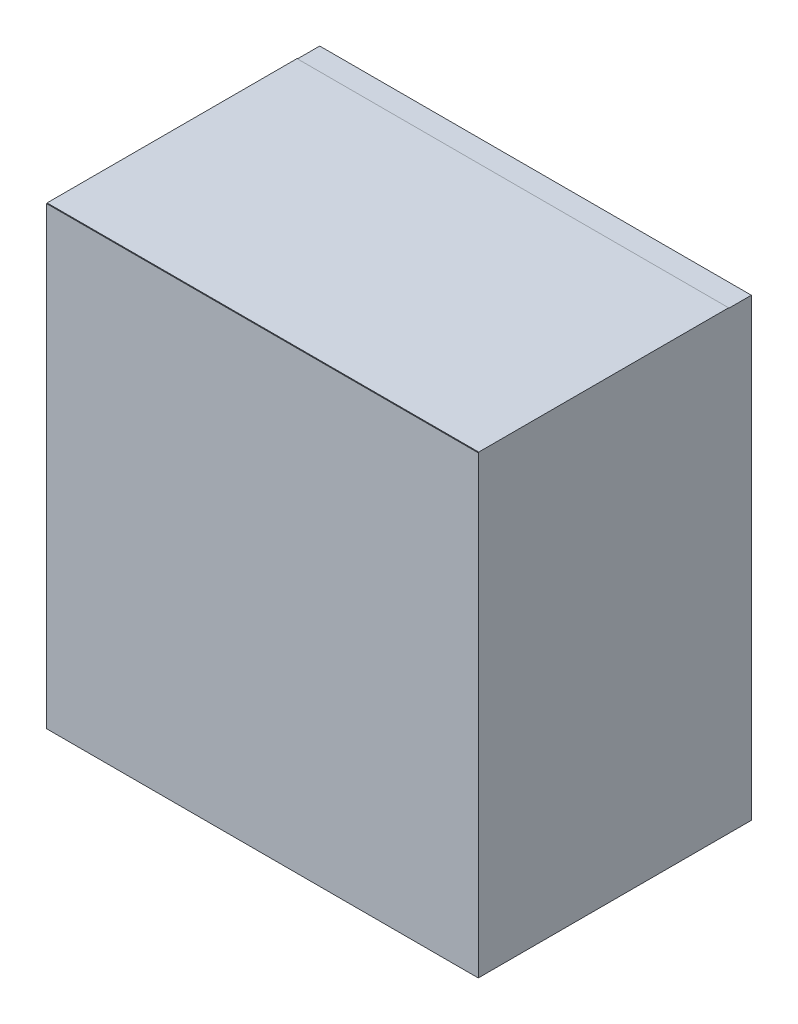
ISO-10303-21;
HEADER;
FILE_DESCRIPTION(('STEP AP214'),'2;1');
FILE_NAME('part.step','',(''),(''),'','','');
FILE_SCHEMA(('AUTOMOTIVE_DESIGN { 1 0 10303 214 1 1 1 1 }'));
ENDSEC;
DATA;
#1=APPLICATION_CONTEXT('core data for automotive mechanical design processes');
#2=APPLICATION_PROTOCOL_DEFINITION('international standard','automotive_design',2000,#1);
#3=PRODUCT_CONTEXT('',#1,'mechanical');
#4=PRODUCT('Part','Part','',(#3));
#5=PRODUCT_RELATED_PRODUCT_CATEGORY('part','',(#4));
#6=PRODUCT_DEFINITION_FORMATION('','',#4);
#7=PRODUCT_DEFINITION_CONTEXT('part definition',#1,'design');
#8=PRODUCT_DEFINITION('design','',#6,#7);
#9=PRODUCT_DEFINITION_SHAPE('','',#8);
#10=(LENGTH_UNIT() NAMED_UNIT(*) SI_UNIT(.MILLI.,.METRE.));
#11=(NAMED_UNIT(*) PLANE_ANGLE_UNIT() SI_UNIT($,.RADIAN.));
#12=(NAMED_UNIT(*) SI_UNIT($,.STERADIAN.) SOLID_ANGLE_UNIT());
#13=UNCERTAINTY_MEASURE_WITH_UNIT(LENGTH_MEASURE(1.E-05),#10,'distance_accuracy_value','');
#14=(GEOMETRIC_REPRESENTATION_CONTEXT(3) GLOBAL_UNCERTAINTY_ASSIGNED_CONTEXT((#13)) GLOBAL_UNIT_ASSIGNED_CONTEXT((#10,
#11,#12)) REPRESENTATION_CONTEXT('',''));
#15=CARTESIAN_POINT('',(0.,0.,0.));
#16=DIRECTION('',(0.,0.,1.));
#17=DIRECTION('',(1.,0.,0.));
#18=AXIS2_PLACEMENT_3D('',#15,#16,#17);
#19=CARTESIAN_POINT('',(-950.,1002.,1.16341445918999E-13));
#20=DIRECTION('',(0.,0.,-1.));
#21=DIRECTION('',(-1.,0.,0.));
#22=AXIS2_PLACEMENT_3D('',#19,#20,#21);
#23=PLANE('',#22);
#24=DIRECTION('',(-1.,0.,0.));
#25=VECTOR('',#24,1.);
#26=CARTESIAN_POINT('',(-950.,1001.,0.));
#27=LINE('',#26,#25);
#28=CARTESIAN_POINT('',(0.,1001.,0.));
#29=VERTEX_POINT('',#28);
#30=CARTESIAN_POINT('',(-950.,1001.,0.));
#31=VERTEX_POINT('',#30);
#32=EDGE_CURVE('E132',#29,#31,#27,.T.);
#33=ORIENTED_EDGE('',*,*,#32,.F.);
#34=DIRECTION('',(0.,-1.,0.));
#35=VECTOR('',#34,1.);
#36=CARTESIAN_POINT('',(0.,1002.,0.));
#37=LINE('',#36,#35);
#38=CARTESIAN_POINT('',(0.,1002.,0.));
#39=VERTEX_POINT('',#38);
#40=EDGE_CURVE('E56',#39,#29,#37,.T.);
#41=ORIENTED_EDGE('',*,*,#40,.F.);
#42=DIRECTION('',(1.,0.,0.));
#43=VECTOR('',#42,1.);
#44=CARTESIAN_POINT('',(-950.,1002.,1.16341445918999E-13));
#45=LINE('',#44,#43);
#46=CARTESIAN_POINT('',(-950.,1002.,1.16341445918999E-13));
#47=VERTEX_POINT('',#46);
#48=EDGE_CURVE('E160',#47,#39,#45,.T.);
#49=ORIENTED_EDGE('',*,*,#48,.F.);
#50=DIRECTION('',(0.,-1.,0.));
#51=VECTOR('',#50,1.);
#52=CARTESIAN_POINT('',(-950.,1002.,1.16341445918999E-13));
#53=LINE('',#52,#51);
#54=EDGE_CURVE('E11',#47,#31,#53,.T.);
#55=ORIENTED_EDGE('',*,*,#54,.T.);
#56=EDGE_LOOP('',(#33,#41,#49,#55));
#57=FACE_BOUND('',#56,.T.);
#58=ADVANCED_FACE('F47',(#57),#23,.F.);
#59=CARTESIAN_POINT('',(-950.,1002.,-550.));
#60=DIRECTION('',(1.,0.,0.));
#61=DIRECTION('',(0.,0.,-1.));
#62=AXIS2_PLACEMENT_3D('',#59,#60,#61);
#63=PLANE('',#62);
#64=DIRECTION('',(0.,0.,1.));
#65=VECTOR('',#64,1.);
#66=CARTESIAN_POINT('',(-950.,0.,-600.));
#67=LINE('',#66,#65);
#68=CARTESIAN_POINT('',(-950.,0.,-600.));
#69=VERTEX_POINT('',#68);
#70=CARTESIAN_POINT('',(-950.,0.,1.));
#71=VERTEX_POINT('',#70);
#72=EDGE_CURVE('E108',#69,#71,#67,.T.);
#73=ORIENTED_EDGE('',*,*,#72,.T.);
#74=DIRECTION('',(0.,-1.,0.));
#75=VECTOR('',#74,1.);
#76=CARTESIAN_POINT('',(-950.,1001.,1.));
#77=LINE('',#76,#75);
#78=CARTESIAN_POINT('',(-950.,1001.,1.));
#79=VERTEX_POINT('',#78);
#80=EDGE_CURVE('E112',#79,#71,#77,.T.);
#81=ORIENTED_EDGE('',*,*,#80,.F.);
#82=DIRECTION('',(0.,0.,-1.));
#83=VECTOR('',#82,1.);
#84=CARTESIAN_POINT('',(-950.,1001.,1.));
#85=LINE('',#84,#83);
#86=EDGE_CURVE('E137',#79,#31,#85,.T.);
#87=ORIENTED_EDGE('',*,*,#86,.T.);
#88=ORIENTED_EDGE('',*,*,#54,.F.);
#89=DIRECTION('',(0.,0.,1.));
#90=VECTOR('',#89,1.);
#91=CARTESIAN_POINT('',(-950.,1002.,-550.));
#92=LINE('',#91,#90);
#93=CARTESIAN_POINT('',(-950.,1002.,-550.));
#94=VERTEX_POINT('',#93);
#95=EDGE_CURVE('E158',#94,#47,#92,.T.);
#96=ORIENTED_EDGE('',*,*,#95,.F.);
#97=DIRECTION('',(0.,-1.,0.));
#98=VECTOR('',#97,1.);
#99=CARTESIAN_POINT('',(-950.,1002.,-550.));
#100=LINE('',#99,#98);
#101=CARTESIAN_POINT('',(-950.,1001.,-550.));
#102=VERTEX_POINT('',#101);
#103=EDGE_CURVE('E165',#94,#102,#100,.T.);
#104=ORIENTED_EDGE('',*,*,#103,.T.);
#105=DIRECTION('',(0.,0.,1.));
#106=VECTOR('',#105,1.);
#107=CARTESIAN_POINT('',(-950.,1001.,-600.));
#108=LINE('',#107,#106);
#109=CARTESIAN_POINT('',(-950.,1001.,-600.));
#110=VERTEX_POINT('',#109);
#111=EDGE_CURVE('E150',#110,#102,#108,.T.);
#112=ORIENTED_EDGE('',*,*,#111,.F.);
#113=DIRECTION('',(0.,-1.,0.));
#114=VECTOR('',#113,1.);
#115=CARTESIAN_POINT('',(-950.,1001.,-600.));
#116=LINE('',#115,#114);
#117=EDGE_CURVE('E114',#110,#69,#116,.T.);
#118=ORIENTED_EDGE('',*,*,#117,.T.);
#119=EDGE_LOOP('',(#73,#81,#87,#88,#96,#104,#112,#118));
#120=FACE_BOUND('',#119,.T.);
#121=ADVANCED_FACE('F49',(#120),#63,.F.);
#122=CARTESIAN_POINT('',(0.,1002.,0.));
#123=DIRECTION('',(-1.,0.,0.));
#124=DIRECTION('',(0.,0.,1.));
#125=AXIS2_PLACEMENT_3D('',#122,#123,#124);
#126=PLANE('',#125);
#127=DIRECTION('',(0.,1.,0.));
#128=VECTOR('',#127,1.);
#129=CARTESIAN_POINT('',(0.,1001.,1.));
#130=LINE('',#129,#128);
#131=CARTESIAN_POINT('',(0.,0.,1.));
#132=VERTEX_POINT('',#131);
#133=CARTESIAN_POINT('',(0.,1001.,1.));
#134=VERTEX_POINT('',#133);
#135=EDGE_CURVE('E126',#132,#134,#130,.T.);
#136=ORIENTED_EDGE('',*,*,#135,.F.);
#137=DIRECTION('',(0.,0.,1.));
#138=VECTOR('',#137,1.);
#139=CARTESIAN_POINT('',(0.,0.,-600.));
#140=LINE('',#139,#138);
#141=CARTESIAN_POINT('',(0.,0.,-600.));
#142=VERTEX_POINT('',#141);
#143=EDGE_CURVE('E118',#142,#132,#140,.T.);
#144=ORIENTED_EDGE('',*,*,#143,.F.);
#145=DIRECTION('',(0.,1.,0.));
#146=VECTOR('',#145,1.);
#147=CARTESIAN_POINT('',(0.,1001.,-600.));
#148=LINE('',#147,#146);
#149=CARTESIAN_POINT('',(0.,1001.,-600.));
#150=VERTEX_POINT('',#149);
#151=EDGE_CURVE('E145',#142,#150,#148,.T.);
#152=ORIENTED_EDGE('',*,*,#151,.T.);
#153=DIRECTION('',(0.,0.,1.));
#154=VECTOR('',#153,1.);
#155=CARTESIAN_POINT('',(0.,1001.,-600.));
#156=LINE('',#155,#154);
#157=CARTESIAN_POINT('',(0.,1001.,-550.));
#158=VERTEX_POINT('',#157);
#159=EDGE_CURVE('E154',#150,#158,#156,.T.);
#160=ORIENTED_EDGE('',*,*,#159,.T.);
#161=DIRECTION('',(0.,-1.,0.));
#162=VECTOR('',#161,1.);
#163=CARTESIAN_POINT('',(0.,1002.,-550.));
#164=LINE('',#163,#162);
#165=CARTESIAN_POINT('',(0.,1002.,-550.));
#166=VERTEX_POINT('',#165);
#167=EDGE_CURVE('E170',#166,#158,#164,.T.);
#168=ORIENTED_EDGE('',*,*,#167,.F.);
#169=DIRECTION('',(0.,0.,-1.));
#170=VECTOR('',#169,1.);
#171=CARTESIAN_POINT('',(0.,1002.,0.));
#172=LINE('',#171,#170);
#173=EDGE_CURVE('E162',#39,#166,#172,.T.);
#174=ORIENTED_EDGE('',*,*,#173,.F.);
#175=ORIENTED_EDGE('',*,*,#40,.T.);
#176=DIRECTION('',(0.,0.,-1.));
#177=VECTOR('',#176,1.);
#178=CARTESIAN_POINT('',(0.,1001.,1.));
#179=LINE('',#178,#177);
#180=EDGE_CURVE('E140',#134,#29,#179,.T.);
#181=ORIENTED_EDGE('',*,*,#180,.F.);
#182=EDGE_LOOP('',(#136,#144,#152,#160,#168,#174,#175,#181));
#183=FACE_BOUND('',#182,.T.);
#184=ADVANCED_FACE('F177',(#183),#126,.F.);
#185=CARTESIAN_POINT('',(0.,1002.,-550.));
#186=DIRECTION('',(0.,0.,1.));
#187=DIRECTION('',(1.,0.,0.));
#188=AXIS2_PLACEMENT_3D('',#185,#186,#187);
#189=PLANE('',#188);
#190=DIRECTION('',(-1.,0.,0.));
#191=VECTOR('',#190,1.);
#192=CARTESIAN_POINT('',(0.,1001.,-550.));
#193=LINE('',#192,#191);
#194=EDGE_CURVE('E153',#158,#102,#193,.T.);
#195=ORIENTED_EDGE('',*,*,#194,.T.);
#196=ORIENTED_EDGE('',*,*,#103,.F.);
#197=DIRECTION('',(-1.,0.,0.));
#198=VECTOR('',#197,1.);
#199=CARTESIAN_POINT('',(0.,1002.,-550.));
#200=LINE('',#199,#198);
#201=EDGE_CURVE('E63',#166,#94,#200,.T.);
#202=ORIENTED_EDGE('',*,*,#201,.F.);
#203=ORIENTED_EDGE('',*,*,#167,.T.);
#204=EDGE_LOOP('',(#195,#196,#202,#203));
#205=FACE_BOUND('',#204,.T.);
#206=ADVANCED_FACE('F187',(#205),#189,.F.);
#207=CARTESIAN_POINT('',(0.,1002.,0.));
#208=DIRECTION('',(0.,1.,0.));
#209=DIRECTION('',(0.,0.,1.));
#210=AXIS2_PLACEMENT_3D('',#207,#208,#209);
#211=PLANE('',#210);
#212=ORIENTED_EDGE('',*,*,#95,.T.);
#213=ORIENTED_EDGE('',*,*,#48,.T.);
#214=ORIENTED_EDGE('',*,*,#173,.T.);
#215=ORIENTED_EDGE('',*,*,#201,.T.);
#216=EDGE_LOOP('',(#212,#213,#214,#215));
#217=FACE_BOUND('',#216,.T.);
#218=ADVANCED_FACE('F185',(#217),#211,.T.);
#219=CARTESIAN_POINT('',(-950.,1001.,-600.));
#220=DIRECTION('',(0.,1.,0.));
#221=DIRECTION('',(0.,0.,1.));
#222=AXIS2_PLACEMENT_3D('',#219,#220,#221);
#223=PLANE('',#222);
#224=ORIENTED_EDGE('',*,*,#194,.F.);
#225=ORIENTED_EDGE('',*,*,#159,.F.);
#226=DIRECTION('',(-1.,0.,0.));
#227=VECTOR('',#226,1.);
#228=CARTESIAN_POINT('',(-950.,1001.,-600.));
#229=LINE('',#228,#227);
#230=EDGE_CURVE('E119',#150,#110,#229,.T.);
#231=ORIENTED_EDGE('',*,*,#230,.T.);
#232=ORIENTED_EDGE('',*,*,#111,.T.);
#233=EDGE_LOOP('',(#224,#225,#231,#232));
#234=FACE_BOUND('',#233,.T.);
#235=ADVANCED_FACE('F189',(#234),#223,.T.);
#236=CARTESIAN_POINT('',(-950.,0.,-600.));
#237=DIRECTION('',(0.,-1.,0.));
#238=DIRECTION('',(0.,0.,-1.));
#239=AXIS2_PLACEMENT_3D('',#236,#237,#238);
#240=PLANE('',#239);
#241=DIRECTION('',(1.,0.,0.));
#242=VECTOR('',#241,1.);
#243=CARTESIAN_POINT('',(-950.,0.,1.));
#244=LINE('',#243,#242);
#245=EDGE_CURVE('E122',#71,#132,#244,.T.);
#246=ORIENTED_EDGE('',*,*,#245,.F.);
#247=ORIENTED_EDGE('',*,*,#72,.F.);
#248=DIRECTION('',(1.,0.,0.));
#249=VECTOR('',#248,1.);
#250=CARTESIAN_POINT('',(-950.,0.,-600.));
#251=LINE('',#250,#249);
#252=EDGE_CURVE('E143',#69,#142,#251,.T.);
#253=ORIENTED_EDGE('',*,*,#252,.T.);
#254=ORIENTED_EDGE('',*,*,#143,.T.);
#255=EDGE_LOOP('',(#246,#247,#253,#254));
#256=FACE_BOUND('',#255,.T.);
#257=ADVANCED_FACE('F123',(#256),#240,.T.);
#258=CARTESIAN_POINT('',(0.,0.,-600.));
#259=DIRECTION('',(0.,0.,1.));
#260=DIRECTION('',(1.,0.,0.));
#261=AXIS2_PLACEMENT_3D('',#258,#259,#260);
#262=PLANE('',#261);
#263=ORIENTED_EDGE('',*,*,#117,.F.);
#264=ORIENTED_EDGE('',*,*,#230,.F.);
#265=ORIENTED_EDGE('',*,*,#151,.F.);
#266=ORIENTED_EDGE('',*,*,#252,.F.);
#267=EDGE_LOOP('',(#263,#264,#265,#266));
#268=FACE_BOUND('',#267,.T.);
#269=ADVANCED_FACE('F192',(#268),#262,.F.);
#270=CARTESIAN_POINT('',(-950.,1001.,1.));
#271=DIRECTION('',(0.,-1.,0.));
#272=DIRECTION('',(0.,0.,-1.));
#273=AXIS2_PLACEMENT_3D('',#270,#271,#272);
#274=PLANE('',#273);
#275=ORIENTED_EDGE('',*,*,#32,.T.);
#276=ORIENTED_EDGE('',*,*,#86,.F.);
#277=DIRECTION('',(-1.,0.,0.));
#278=VECTOR('',#277,1.);
#279=CARTESIAN_POINT('',(-950.,1001.,1.));
#280=LINE('',#279,#278);
#281=EDGE_CURVE('E130',#134,#79,#280,.T.);
#282=ORIENTED_EDGE('',*,*,#281,.F.);
#283=ORIENTED_EDGE('',*,*,#180,.T.);
#284=EDGE_LOOP('',(#275,#276,#282,#283));
#285=FACE_BOUND('',#284,.T.);
#286=ADVANCED_FACE('F183',(#285),#274,.F.);
#287=CARTESIAN_POINT('',(0.,0.,1.));
#288=DIRECTION('',(0.,0.,1.));
#289=DIRECTION('',(1.,0.,0.));
#290=AXIS2_PLACEMENT_3D('',#287,#288,#289);
#291=PLANE('',#290);
#292=ORIENTED_EDGE('',*,*,#80,.T.);
#293=ORIENTED_EDGE('',*,*,#245,.T.);
#294=ORIENTED_EDGE('',*,*,#135,.T.);
#295=ORIENTED_EDGE('',*,*,#281,.T.);
#296=EDGE_LOOP('',(#292,#293,#294,#295));
#297=FACE_BOUND('',#296,.T.);
#298=ADVANCED_FACE('F128',(#297),#291,.T.);
#299=CLOSED_SHELL('',(#58,#121,#184,#206,#218,#235,#257,#269,#286,#298));
#300=MANIFOLD_SOLID_BREP('B2',#299);
#301=ADVANCED_BREP_SHAPE_REPRESENTATION('',(#18,#300),#14);
#302=SHAPE_DEFINITION_REPRESENTATION(#9,#301);
ENDSEC;
END-ISO-10303-21;
